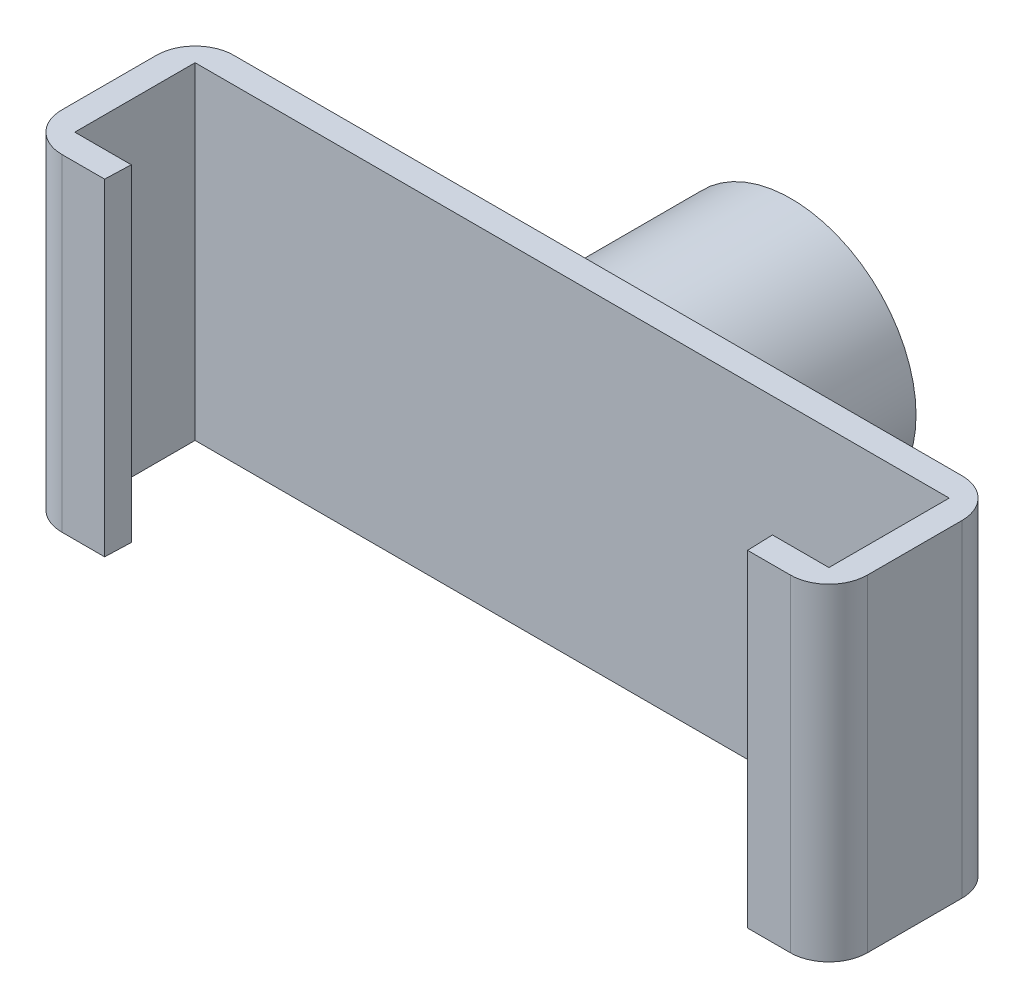
ISO-10303-21;
HEADER;
FILE_DESCRIPTION(('STEP AP214'),'2;1');
FILE_NAME('part.step','',(''),(''),'','','');
FILE_SCHEMA(('AUTOMOTIVE_DESIGN { 1 0 10303 214 1 1 1 1 }'));
ENDSEC;
DATA;
#1=APPLICATION_CONTEXT('core data for automotive mechanical design processes');
#2=APPLICATION_PROTOCOL_DEFINITION('international standard','automotive_design',2000,#1);
#3=PRODUCT_CONTEXT('',#1,'mechanical');
#4=PRODUCT('Part','Part','',(#3));
#5=PRODUCT_RELATED_PRODUCT_CATEGORY('part','',(#4));
#6=PRODUCT_DEFINITION_FORMATION('','',#4);
#7=PRODUCT_DEFINITION_CONTEXT('part definition',#1,'design');
#8=PRODUCT_DEFINITION('design','',#6,#7);
#9=PRODUCT_DEFINITION_SHAPE('','',#8);
#10=(LENGTH_UNIT() NAMED_UNIT(*) SI_UNIT(.MILLI.,.METRE.));
#11=(NAMED_UNIT(*) PLANE_ANGLE_UNIT() SI_UNIT($,.RADIAN.));
#12=(NAMED_UNIT(*) SI_UNIT($,.STERADIAN.) SOLID_ANGLE_UNIT());
#13=UNCERTAINTY_MEASURE_WITH_UNIT(LENGTH_MEASURE(1.E-05),#10,'distance_accuracy_value','');
#14=(GEOMETRIC_REPRESENTATION_CONTEXT(3) GLOBAL_UNCERTAINTY_ASSIGNED_CONTEXT((#13)) GLOBAL_UNIT_ASSIGNED_CONTEXT((#10,
#11,#12)) REPRESENTATION_CONTEXT('',''));
#15=CARTESIAN_POINT('',(0.,0.,0.));
#16=DIRECTION('',(0.,0.,1.));
#17=DIRECTION('',(1.,0.,0.));
#18=AXIS2_PLACEMENT_3D('',#15,#16,#17);
#19=CARTESIAN_POINT('',(-31.275,12.7,-2.));
#20=DIRECTION('',(0.,0.,1.));
#21=DIRECTION('',(1.,0.,0.));
#22=AXIS2_PLACEMENT_3D('',#19,#20,#21);
#23=PLANE('',#22);
#24=CARTESIAN_POINT('',(0.,0.,-2.));
#25=DIRECTION('',(0.,0.,1.));
#26=DIRECTION('',(1.,0.,0.));
#27=AXIS2_PLACEMENT_3D('',#24,#25,#26);
#28=CIRCLE('',#27,11.7);
#29=CARTESIAN_POINT('',(11.7,0.,-2.));
#30=VERTEX_POINT('',#29);
#31=EDGE_CURVE('E11',#30,#30,#28,.T.);
#32=ORIENTED_EDGE('',*,*,#31,.T.);
#33=EDGE_LOOP('',(#32));
#34=FACE_BOUND('',#33,.T.);
#35=DIRECTION('',(-1.,0.,0.));
#36=VECTOR('',#35,1.);
#37=CARTESIAN_POINT('',(-31.275,12.7,-2.));
#38=LINE('',#37,#36);
#39=CARTESIAN_POINT('',(28.275,12.7,-2.));
#40=VERTEX_POINT('',#39);
#41=CARTESIAN_POINT('',(-28.275,12.7,-2.));
#42=VERTEX_POINT('',#41);
#43=EDGE_CURVE('E353',#40,#42,#38,.T.);
#44=ORIENTED_EDGE('',*,*,#43,.F.);
#45=DIRECTION('',(0.,-1.,0.));
#46=VECTOR('',#45,1.);
#47=CARTESIAN_POINT('',(28.275,12.7,-2.));
#48=LINE('',#47,#46);
#49=CARTESIAN_POINT('',(28.275,-12.7,-2.));
#50=VERTEX_POINT('',#49);
#51=EDGE_CURVE('E177',#40,#50,#48,.T.);
#52=ORIENTED_EDGE('',*,*,#51,.T.);
#53=DIRECTION('',(-1.,0.,0.));
#54=VECTOR('',#53,1.);
#55=CARTESIAN_POINT('',(-31.275,-12.7,-2.));
#56=LINE('',#55,#54);
#57=CARTESIAN_POINT('',(-28.275,-12.7,-2.));
#58=VERTEX_POINT('',#57);
#59=EDGE_CURVE('E305',#50,#58,#56,.T.);
#60=ORIENTED_EDGE('',*,*,#59,.T.);
#61=DIRECTION('',(0.,-1.,0.));
#62=VECTOR('',#61,1.);
#63=CARTESIAN_POINT('',(-28.275,12.7,-2.));
#64=LINE('',#63,#62);
#65=EDGE_CURVE('E175',#58,#42,#64,.F.);
#66=ORIENTED_EDGE('',*,*,#65,.T.);
#67=EDGE_LOOP('',(#44,#52,#60,#66));
#68=FACE_BOUND('',#67,.T.);
#69=ADVANCED_FACE('F34',(#34,#68),#23,.F.);
#70=CARTESIAN_POINT('',(-29.275,12.7,9.34));
#71=DIRECTION('',(0.,0.,1.));
#72=DIRECTION('',(1.,0.,0.));
#73=AXIS2_PLACEMENT_3D('',#70,#71,#72);
#74=PLANE('',#73);
#75=DIRECTION('',(-1.,0.,0.));
#76=VECTOR('',#75,1.);
#77=CARTESIAN_POINT('',(-29.275,-12.7,9.34));
#78=LINE('',#77,#76);
#79=CARTESIAN_POINT('',(-24.89,-12.7,9.34));
#80=VERTEX_POINT('',#79);
#81=CARTESIAN_POINT('',(-29.275,-12.7,9.34));
#82=VERTEX_POINT('',#81);
#83=EDGE_CURVE('E174',#80,#82,#78,.T.);
#84=ORIENTED_EDGE('',*,*,#83,.T.);
#85=DIRECTION('',(0.,-1.,0.));
#86=VECTOR('',#85,1.);
#87=CARTESIAN_POINT('',(-29.275,12.7,9.34));
#88=LINE('',#87,#86);
#89=CARTESIAN_POINT('',(-29.275,12.7,9.34));
#90=VERTEX_POINT('',#89);
#91=EDGE_CURVE('E154',#90,#82,#88,.T.);
#92=ORIENTED_EDGE('',*,*,#91,.F.);
#93=DIRECTION('',(-1.,0.,0.));
#94=VECTOR('',#93,1.);
#95=CARTESIAN_POINT('',(-29.275,12.7,9.34));
#96=LINE('',#95,#94);
#97=CARTESIAN_POINT('',(-24.89,12.7,9.34));
#98=VERTEX_POINT('',#97);
#99=EDGE_CURVE('E160',#98,#90,#96,.T.);
#100=ORIENTED_EDGE('',*,*,#99,.F.);
#101=DIRECTION('',(0.,-1.,0.));
#102=VECTOR('',#101,1.);
#103=CARTESIAN_POINT('',(-24.89,12.7,9.34));
#104=LINE('',#103,#102);
#105=EDGE_CURVE('E309',#98,#80,#104,.T.);
#106=ORIENTED_EDGE('',*,*,#105,.T.);
#107=EDGE_LOOP('',(#84,#92,#100,#106));
#108=FACE_BOUND('',#107,.T.);
#109=ADVANCED_FACE('F172',(#108),#74,.F.);
#110=CARTESIAN_POINT('',(-29.275,12.7,9.34));
#111=DIRECTION('',(-1.,0.,0.));
#112=DIRECTION('',(0.,0.,1.));
#113=AXIS2_PLACEMENT_3D('',#110,#111,#112);
#114=PLANE('',#113);
#115=DIRECTION('',(0.,0.,-1.));
#116=VECTOR('',#115,1.);
#117=CARTESIAN_POINT('',(-29.275,-12.7,9.34));
#118=LINE('',#117,#116);
#119=CARTESIAN_POINT('',(-29.275,-12.7,0.));
#120=VERTEX_POINT('',#119);
#121=EDGE_CURVE('E335',#82,#120,#118,.T.);
#122=ORIENTED_EDGE('',*,*,#121,.T.);
#123=DIRECTION('',(0.,-1.,0.));
#124=VECTOR('',#123,1.);
#125=CARTESIAN_POINT('',(-29.275,12.7,0.));
#126=LINE('',#125,#124);
#127=CARTESIAN_POINT('',(-29.275,12.7,0.));
#128=VERTEX_POINT('',#127);
#129=EDGE_CURVE('E157',#128,#120,#126,.T.);
#130=ORIENTED_EDGE('',*,*,#129,.F.);
#131=DIRECTION('',(0.,0.,-1.));
#132=VECTOR('',#131,1.);
#133=CARTESIAN_POINT('',(-29.275,12.7,9.34));
#134=LINE('',#133,#132);
#135=EDGE_CURVE('E149',#90,#128,#134,.T.);
#136=ORIENTED_EDGE('',*,*,#135,.F.);
#137=ORIENTED_EDGE('',*,*,#91,.T.);
#138=EDGE_LOOP('',(#122,#130,#136,#137));
#139=FACE_BOUND('',#138,.T.);
#140=ADVANCED_FACE('F152',(#139),#114,.F.);
#141=CARTESIAN_POINT('',(29.275,12.7,0.));
#142=DIRECTION('',(0.,0.,-1.));
#143=DIRECTION('',(-1.,0.,0.));
#144=AXIS2_PLACEMENT_3D('',#141,#142,#143);
#145=PLANE('',#144);
#146=DIRECTION('',(1.,0.,0.));
#147=VECTOR('',#146,1.);
#148=CARTESIAN_POINT('',(29.275,-12.7,0.));
#149=LINE('',#148,#147);
#150=CARTESIAN_POINT('',(29.275,-12.7,0.));
#151=VERTEX_POINT('',#150);
#152=EDGE_CURVE('E329',#120,#151,#149,.T.);
#153=ORIENTED_EDGE('',*,*,#152,.T.);
#154=DIRECTION('',(0.,-1.,0.));
#155=VECTOR('',#154,1.);
#156=CARTESIAN_POINT('',(29.275,12.7,0.));
#157=LINE('',#156,#155);
#158=CARTESIAN_POINT('',(29.275,12.7,0.));
#159=VERTEX_POINT('',#158);
#160=EDGE_CURVE('E179',#159,#151,#157,.T.);
#161=ORIENTED_EDGE('',*,*,#160,.F.);
#162=DIRECTION('',(1.,0.,0.));
#163=VECTOR('',#162,1.);
#164=CARTESIAN_POINT('',(-20.505,12.7,0.));
#165=LINE('',#164,#163);
#166=EDGE_CURVE('E159',#128,#159,#165,.T.);
#167=ORIENTED_EDGE('',*,*,#166,.F.);
#168=ORIENTED_EDGE('',*,*,#129,.T.);
#169=EDGE_LOOP('',(#153,#161,#167,#168));
#170=FACE_BOUND('',#169,.T.);
#171=ADVANCED_FACE('F264',(#170),#145,.F.);
#172=CARTESIAN_POINT('',(29.275,12.7,0.));
#173=DIRECTION('',(1.,0.,0.));
#174=DIRECTION('',(0.,0.,-1.));
#175=AXIS2_PLACEMENT_3D('',#172,#173,#174);
#176=PLANE('',#175);
#177=DIRECTION('',(0.,0.,1.));
#178=VECTOR('',#177,1.);
#179=CARTESIAN_POINT('',(29.275,-12.7,0.));
#180=LINE('',#179,#178);
#181=CARTESIAN_POINT('',(29.275,-12.7,9.34));
#182=VERTEX_POINT('',#181);
#183=EDGE_CURVE('E326',#151,#182,#180,.T.);
#184=ORIENTED_EDGE('',*,*,#183,.T.);
#185=DIRECTION('',(0.,-1.,0.));
#186=VECTOR('',#185,1.);
#187=CARTESIAN_POINT('',(29.275,12.7,9.34));
#188=LINE('',#187,#186);
#189=CARTESIAN_POINT('',(29.275,12.7,9.34));
#190=VERTEX_POINT('',#189);
#191=EDGE_CURVE('E319',#190,#182,#188,.T.);
#192=ORIENTED_EDGE('',*,*,#191,.F.);
#193=DIRECTION('',(0.,0.,1.));
#194=VECTOR('',#193,1.);
#195=CARTESIAN_POINT('',(29.275,12.7,0.));
#196=LINE('',#195,#194);
#197=EDGE_CURVE('E327',#159,#190,#196,.T.);
#198=ORIENTED_EDGE('',*,*,#197,.F.);
#199=ORIENTED_EDGE('',*,*,#160,.T.);
#200=EDGE_LOOP('',(#184,#192,#198,#199));
#201=FACE_BOUND('',#200,.T.);
#202=ADVANCED_FACE('F260',(#201),#176,.F.);
#203=CARTESIAN_POINT('',(24.89,12.7,9.34));
#204=DIRECTION('',(0.,0.,1.));
#205=DIRECTION('',(1.,0.,0.));
#206=AXIS2_PLACEMENT_3D('',#203,#204,#205);
#207=PLANE('',#206);
#208=DIRECTION('',(-1.,0.,0.));
#209=VECTOR('',#208,1.);
#210=CARTESIAN_POINT('',(24.89,-12.7,9.34));
#211=LINE('',#210,#209);
#212=CARTESIAN_POINT('',(24.89,-12.7,9.34));
#213=VERTEX_POINT('',#212);
#214=EDGE_CURVE('E331',#182,#213,#211,.T.);
#215=ORIENTED_EDGE('',*,*,#214,.T.);
#216=DIRECTION('',(0.,-1.,0.));
#217=VECTOR('',#216,1.);
#218=CARTESIAN_POINT('',(24.89,12.7,9.34));
#219=LINE('',#218,#217);
#220=CARTESIAN_POINT('',(24.89,12.7,9.34));
#221=VERTEX_POINT('',#220);
#222=EDGE_CURVE('E316',#221,#213,#219,.T.);
#223=ORIENTED_EDGE('',*,*,#222,.F.);
#224=DIRECTION('',(-1.,0.,0.));
#225=VECTOR('',#224,1.);
#226=CARTESIAN_POINT('',(24.89,12.7,9.34));
#227=LINE('',#226,#225);
#228=EDGE_CURVE('E362',#190,#221,#227,.T.);
#229=ORIENTED_EDGE('',*,*,#228,.F.);
#230=ORIENTED_EDGE('',*,*,#191,.T.);
#231=EDGE_LOOP('',(#215,#223,#229,#230));
#232=FACE_BOUND('',#231,.T.);
#233=ADVANCED_FACE('F256',(#232),#207,.F.);
#234=CARTESIAN_POINT('',(24.96,12.7,11.34));
#235=DIRECTION('',(0.999388062160532,0.,-0.0349785821756086));
#236=DIRECTION('',(-0.0349785821756086,0.,-0.999388062160533));
#237=AXIS2_PLACEMENT_3D('',#234,#235,#236);
#238=PLANE('',#237);
#239=DIRECTION('',(0.0349785821756086,0.,0.999388062160533));
#240=VECTOR('',#239,1.);
#241=CARTESIAN_POINT('',(24.96,-12.7,11.34));
#242=LINE('',#241,#240);
#243=CARTESIAN_POINT('',(24.96,-12.7,11.34));
#244=VERTEX_POINT('',#243);
#245=EDGE_CURVE('E333',#213,#244,#242,.T.);
#246=ORIENTED_EDGE('',*,*,#245,.T.);
#247=DIRECTION('',(0.,-1.,0.));
#248=VECTOR('',#247,1.);
#249=CARTESIAN_POINT('',(24.96,12.7,11.34));
#250=LINE('',#249,#248);
#251=CARTESIAN_POINT('',(24.96,12.7,11.34));
#252=VERTEX_POINT('',#251);
#253=EDGE_CURVE('E313',#252,#244,#250,.T.);
#254=ORIENTED_EDGE('',*,*,#253,.F.);
#255=DIRECTION('',(0.0349785821756086,0.,0.999388062160533));
#256=VECTOR('',#255,1.);
#257=CARTESIAN_POINT('',(24.96,12.7,11.34));
#258=LINE('',#257,#256);
#259=EDGE_CURVE('E366',#221,#252,#258,.T.);
#260=ORIENTED_EDGE('',*,*,#259,.F.);
#261=ORIENTED_EDGE('',*,*,#222,.T.);
#262=EDGE_LOOP('',(#246,#254,#260,#261));
#263=FACE_BOUND('',#262,.T.);
#264=ADVANCED_FACE('F252',(#263),#238,.F.);
#265=CARTESIAN_POINT('',(31.275,12.7,11.34));
#266=DIRECTION('',(0.,0.,-1.));
#267=DIRECTION('',(-1.,0.,0.));
#268=AXIS2_PLACEMENT_3D('',#265,#266,#267);
#269=PLANE('',#268);
#270=DIRECTION('',(1.,0.,0.));
#271=VECTOR('',#270,1.);
#272=CARTESIAN_POINT('',(31.275,-12.7,11.34));
#273=LINE('',#272,#271);
#274=CARTESIAN_POINT('',(28.275,-12.7,11.34));
#275=VERTEX_POINT('',#274);
#276=EDGE_CURVE('E340',#244,#275,#273,.T.);
#277=ORIENTED_EDGE('',*,*,#276,.T.);
#278=DIRECTION('',(0.,-1.,0.));
#279=VECTOR('',#278,1.);
#280=CARTESIAN_POINT('',(28.275,12.7,11.34));
#281=LINE('',#280,#279);
#282=CARTESIAN_POINT('',(28.275,12.7,11.34));
#283=VERTEX_POINT('',#282);
#284=EDGE_CURVE('E205',#275,#283,#281,.F.);
#285=ORIENTED_EDGE('',*,*,#284,.T.);
#286=DIRECTION('',(1.,0.,0.));
#287=VECTOR('',#286,1.);
#288=CARTESIAN_POINT('',(31.275,12.7,11.34));
#289=LINE('',#288,#287);
#290=EDGE_CURVE('E368',#252,#283,#289,.T.);
#291=ORIENTED_EDGE('',*,*,#290,.F.);
#292=ORIENTED_EDGE('',*,*,#253,.T.);
#293=EDGE_LOOP('',(#277,#285,#291,#292));
#294=FACE_BOUND('',#293,.T.);
#295=ADVANCED_FACE('F248',(#294),#269,.F.);
#296=CARTESIAN_POINT('',(31.275,12.7,-2.));
#297=DIRECTION('',(-1.,0.,0.));
#298=DIRECTION('',(0.,0.,1.));
#299=AXIS2_PLACEMENT_3D('',#296,#297,#298);
#300=PLANE('',#299);
#301=DIRECTION('',(0.,0.,-1.));
#302=VECTOR('',#301,1.);
#303=CARTESIAN_POINT('',(31.275,-12.7,-2.));
#304=LINE('',#303,#302);
#305=CARTESIAN_POINT('',(31.275,-12.7,8.34));
#306=VERTEX_POINT('',#305);
#307=CARTESIAN_POINT('',(31.275,-12.7,1.));
#308=VERTEX_POINT('',#307);
#309=EDGE_CURVE('E343',#306,#308,#304,.T.);
#310=ORIENTED_EDGE('',*,*,#309,.T.);
#311=DIRECTION('',(0.,-1.,0.));
#312=VECTOR('',#311,1.);
#313=CARTESIAN_POINT('',(31.275,12.7,1.));
#314=LINE('',#313,#312);
#315=CARTESIAN_POINT('',(31.275,12.7,1.));
#316=VERTEX_POINT('',#315);
#317=EDGE_CURVE('E196',#308,#316,#314,.F.);
#318=ORIENTED_EDGE('',*,*,#317,.T.);
#319=DIRECTION('',(0.,0.,-1.));
#320=VECTOR('',#319,1.);
#321=CARTESIAN_POINT('',(31.275,12.7,-2.));
#322=LINE('',#321,#320);
#323=CARTESIAN_POINT('',(31.275,12.7,8.34));
#324=VERTEX_POINT('',#323);
#325=EDGE_CURVE('E356',#324,#316,#322,.T.);
#326=ORIENTED_EDGE('',*,*,#325,.F.);
#327=DIRECTION('',(0.,-1.,0.));
#328=VECTOR('',#327,1.);
#329=CARTESIAN_POINT('',(31.275,12.7,8.34));
#330=LINE('',#329,#328);
#331=EDGE_CURVE('E193',#324,#306,#330,.T.);
#332=ORIENTED_EDGE('',*,*,#331,.T.);
#333=EDGE_LOOP('',(#310,#318,#326,#332));
#334=FACE_BOUND('',#333,.T.);
#335=ADVANCED_FACE('F245',(#334),#300,.F.);
#336=CARTESIAN_POINT('',(-31.275,12.7,11.34));
#337=DIRECTION('',(1.,0.,0.));
#338=DIRECTION('',(0.,0.,-1.));
#339=AXIS2_PLACEMENT_3D('',#336,#337,#338);
#340=PLANE('',#339);
#341=DIRECTION('',(0.,0.,1.));
#342=VECTOR('',#341,1.);
#343=CARTESIAN_POINT('',(-31.275,12.7,11.34));
#344=LINE('',#343,#342);
#345=CARTESIAN_POINT('',(-31.275,12.7,1.));
#346=VERTEX_POINT('',#345);
#347=CARTESIAN_POINT('',(-31.275,12.7,8.34));
#348=VERTEX_POINT('',#347);
#349=EDGE_CURVE('E352',#346,#348,#344,.T.);
#350=ORIENTED_EDGE('',*,*,#349,.F.);
#351=DIRECTION('',(0.,-1.,0.));
#352=VECTOR('',#351,1.);
#353=CARTESIAN_POINT('',(-31.275,12.7,1.));
#354=LINE('',#353,#352);
#355=CARTESIAN_POINT('',(-31.275,-12.7,1.));
#356=VERTEX_POINT('',#355);
#357=EDGE_CURVE('E208',#346,#356,#354,.T.);
#358=ORIENTED_EDGE('',*,*,#357,.T.);
#359=DIRECTION('',(0.,0.,1.));
#360=VECTOR('',#359,1.);
#361=CARTESIAN_POINT('',(-31.275,-12.7,11.34));
#362=LINE('',#361,#360);
#363=CARTESIAN_POINT('',(-31.275,-12.7,8.34));
#364=VERTEX_POINT('',#363);
#365=EDGE_CURVE('E302',#356,#364,#362,.T.);
#366=ORIENTED_EDGE('',*,*,#365,.T.);
#367=DIRECTION('',(0.,-1.,0.));
#368=VECTOR('',#367,1.);
#369=CARTESIAN_POINT('',(-31.275,12.7,8.34));
#370=LINE('',#369,#368);
#371=EDGE_CURVE('E57',#364,#348,#370,.F.);
#372=ORIENTED_EDGE('',*,*,#371,.T.);
#373=EDGE_LOOP('',(#350,#358,#366,#372));
#374=FACE_BOUND('',#373,.T.);
#375=ADVANCED_FACE('F243',(#374),#340,.F.);
#376=CARTESIAN_POINT('',(-24.96,12.7,11.34));
#377=DIRECTION('',(0.,0.,-1.));
#378=DIRECTION('',(-1.,0.,0.));
#379=AXIS2_PLACEMENT_3D('',#376,#377,#378);
#380=PLANE('',#379);
#381=DIRECTION('',(1.,0.,0.));
#382=VECTOR('',#381,1.);
#383=CARTESIAN_POINT('',(-24.96,12.7,11.34));
#384=LINE('',#383,#382);
#385=CARTESIAN_POINT('',(-28.275,12.7,11.34));
#386=VERTEX_POINT('',#385);
#387=CARTESIAN_POINT('',(-24.96,12.7,11.34));
#388=VERTEX_POINT('',#387);
#389=EDGE_CURVE('E297',#386,#388,#384,.T.);
#390=ORIENTED_EDGE('',*,*,#389,.F.);
#391=DIRECTION('',(0.,-1.,0.));
#392=VECTOR('',#391,1.);
#393=CARTESIAN_POINT('',(-28.275,12.7,11.34));
#394=LINE('',#393,#392);
#395=CARTESIAN_POINT('',(-28.275,-12.7,11.34));
#396=VERTEX_POINT('',#395);
#397=EDGE_CURVE('E211',#386,#396,#394,.T.);
#398=ORIENTED_EDGE('',*,*,#397,.T.);
#399=DIRECTION('',(1.,0.,0.));
#400=VECTOR('',#399,1.);
#401=CARTESIAN_POINT('',(-24.96,-12.7,11.34));
#402=LINE('',#401,#400);
#403=CARTESIAN_POINT('',(-24.96,-12.7,11.34));
#404=VERTEX_POINT('',#403);
#405=EDGE_CURVE('E295',#396,#404,#402,.T.);
#406=ORIENTED_EDGE('',*,*,#405,.T.);
#407=DIRECTION('',(0.,-1.,0.));
#408=VECTOR('',#407,1.);
#409=CARTESIAN_POINT('',(-24.96,12.7,11.34));
#410=LINE('',#409,#408);
#411=EDGE_CURVE('E311',#388,#404,#410,.T.);
#412=ORIENTED_EDGE('',*,*,#411,.F.);
#413=EDGE_LOOP('',(#390,#398,#406,#412));
#414=FACE_BOUND('',#413,.T.);
#415=ADVANCED_FACE('F293',(#414),#380,.F.);
#416=CARTESIAN_POINT('',(-24.89,12.7,9.34));
#417=DIRECTION('',(-0.999388062160532,0.,-0.0349785821756171));
#418=DIRECTION('',(-0.0349785821756171,0.,0.999388062160532));
#419=AXIS2_PLACEMENT_3D('',#416,#417,#418);
#420=PLANE('',#419);
#421=DIRECTION('',(0.0349785821756171,0.,-0.999388062160532));
#422=VECTOR('',#421,1.);
#423=CARTESIAN_POINT('',(-24.89,-12.7,9.34));
#424=LINE('',#423,#422);
#425=EDGE_CURVE('E170',#404,#80,#424,.T.);
#426=ORIENTED_EDGE('',*,*,#425,.T.);
#427=ORIENTED_EDGE('',*,*,#105,.F.);
#428=DIRECTION('',(0.0349785821756171,0.,-0.999388062160532));
#429=VECTOR('',#428,1.);
#430=CARTESIAN_POINT('',(-24.89,12.7,9.34));
#431=LINE('',#430,#429);
#432=EDGE_CURVE('E166',#388,#98,#431,.T.);
#433=ORIENTED_EDGE('',*,*,#432,.F.);
#434=ORIENTED_EDGE('',*,*,#411,.T.);
#435=EDGE_LOOP('',(#426,#427,#433,#434));
#436=FACE_BOUND('',#435,.T.);
#437=ADVANCED_FACE('F396',(#436),#420,.F.);
#438=CARTESIAN_POINT('',(-31.275,12.7,9.34));
#439=DIRECTION('',(0.,1.,0.));
#440=DIRECTION('',(0.,0.,1.));
#441=AXIS2_PLACEMENT_3D('',#438,#439,#440);
#442=PLANE('',#441);
#443=ORIENTED_EDGE('',*,*,#325,.T.);
#444=CARTESIAN_POINT('',(28.275,12.7,1.));
#445=DIRECTION('',(0.,1.,0.));
#446=DIRECTION('',(0.,0.,1.));
#447=AXIS2_PLACEMENT_3D('',#444,#445,#446);
#448=CIRCLE('',#447,3.);
#449=EDGE_CURVE('E203',#316,#40,#448,.T.);
#450=ORIENTED_EDGE('',*,*,#449,.T.);
#451=ORIENTED_EDGE('',*,*,#43,.T.);
#452=CARTESIAN_POINT('',(-28.275,12.7,1.));
#453=DIRECTION('',(0.,1.,0.));
#454=DIRECTION('',(0.,0.,1.));
#455=AXIS2_PLACEMENT_3D('',#452,#453,#454);
#456=CIRCLE('',#455,3.);
#457=EDGE_CURVE('E199',#42,#346,#456,.T.);
#458=ORIENTED_EDGE('',*,*,#457,.T.);
#459=ORIENTED_EDGE('',*,*,#349,.T.);
#460=CARTESIAN_POINT('',(-28.275,12.7,8.34));
#461=DIRECTION('',(0.,1.,0.));
#462=DIRECTION('',(0.,0.,1.));
#463=AXIS2_PLACEMENT_3D('',#460,#461,#462);
#464=CIRCLE('',#463,3.);
#465=EDGE_CURVE('E49',#348,#386,#464,.T.);
#466=ORIENTED_EDGE('',*,*,#465,.T.);
#467=ORIENTED_EDGE('',*,*,#389,.T.);
#468=ORIENTED_EDGE('',*,*,#432,.T.);
#469=ORIENTED_EDGE('',*,*,#99,.T.);
#470=ORIENTED_EDGE('',*,*,#135,.T.);
#471=ORIENTED_EDGE('',*,*,#166,.T.);
#472=ORIENTED_EDGE('',*,*,#197,.T.);
#473=ORIENTED_EDGE('',*,*,#228,.T.);
#474=ORIENTED_EDGE('',*,*,#259,.T.);
#475=ORIENTED_EDGE('',*,*,#290,.T.);
#476=CARTESIAN_POINT('',(28.275,12.7,8.34));
#477=DIRECTION('',(0.,1.,0.));
#478=DIRECTION('',(0.,0.,1.));
#479=AXIS2_PLACEMENT_3D('',#476,#477,#478);
#480=CIRCLE('',#479,3.);
#481=EDGE_CURVE('E201',#283,#324,#480,.T.);
#482=ORIENTED_EDGE('',*,*,#481,.T.);
#483=EDGE_LOOP('',(#443,#450,#451,#458,#459,#466,#467,#468,#469,#470,#471,#472,#473,#474,#475,#482));
#484=FACE_BOUND('',#483,.T.);
#485=ADVANCED_FACE('F164',(#484),#442,.T.);
#486=CARTESIAN_POINT('',(-31.275,-12.7,9.34));
#487=DIRECTION('',(0.,1.,0.));
#488=DIRECTION('',(0.,0.,1.));
#489=AXIS2_PLACEMENT_3D('',#486,#487,#488);
#490=PLANE('',#489);
#491=ORIENTED_EDGE('',*,*,#59,.F.);
#492=CARTESIAN_POINT('',(28.275,-12.7,1.));
#493=DIRECTION('',(0.,1.,0.));
#494=DIRECTION('',(0.,0.,1.));
#495=AXIS2_PLACEMENT_3D('',#492,#493,#494);
#496=CIRCLE('',#495,3.);
#497=EDGE_CURVE('E191',#50,#308,#496,.F.);
#498=ORIENTED_EDGE('',*,*,#497,.T.);
#499=ORIENTED_EDGE('',*,*,#309,.F.);
#500=CARTESIAN_POINT('',(28.275,-12.7,8.34));
#501=DIRECTION('',(0.,1.,0.));
#502=DIRECTION('',(0.,0.,1.));
#503=AXIS2_PLACEMENT_3D('',#500,#501,#502);
#504=CIRCLE('',#503,3.);
#505=EDGE_CURVE('E189',#306,#275,#504,.F.);
#506=ORIENTED_EDGE('',*,*,#505,.T.);
#507=ORIENTED_EDGE('',*,*,#276,.F.);
#508=ORIENTED_EDGE('',*,*,#245,.F.);
#509=ORIENTED_EDGE('',*,*,#214,.F.);
#510=ORIENTED_EDGE('',*,*,#183,.F.);
#511=ORIENTED_EDGE('',*,*,#152,.F.);
#512=ORIENTED_EDGE('',*,*,#121,.F.);
#513=ORIENTED_EDGE('',*,*,#83,.F.);
#514=ORIENTED_EDGE('',*,*,#425,.F.);
#515=ORIENTED_EDGE('',*,*,#405,.F.);
#516=CARTESIAN_POINT('',(-28.275,-12.7,8.34));
#517=DIRECTION('',(0.,1.,0.));
#518=DIRECTION('',(0.,0.,1.));
#519=AXIS2_PLACEMENT_3D('',#516,#517,#518);
#520=CIRCLE('',#519,3.);
#521=EDGE_CURVE('E185',#396,#364,#520,.F.);
#522=ORIENTED_EDGE('',*,*,#521,.T.);
#523=ORIENTED_EDGE('',*,*,#365,.F.);
#524=CARTESIAN_POINT('',(-28.275,-12.7,1.));
#525=DIRECTION('',(0.,1.,0.));
#526=DIRECTION('',(0.,0.,1.));
#527=AXIS2_PLACEMENT_3D('',#524,#525,#526);
#528=CIRCLE('',#527,3.);
#529=EDGE_CURVE('E187',#356,#58,#528,.F.);
#530=ORIENTED_EDGE('',*,*,#529,.T.);
#531=EDGE_LOOP('',(#491,#498,#499,#506,#507,#508,#509,#510,#511,#512,#513,#514,#515,#522,#523,#530));
#532=FACE_BOUND('',#531,.T.);
#533=ADVANCED_FACE('F275',(#532),#490,.F.);
#534=CARTESIAN_POINT('',(28.275,12.7,1.));
#535=DIRECTION('',(0.,-1.,0.));
#536=DIRECTION('',(0.,0.,-1.));
#537=AXIS2_PLACEMENT_3D('',#534,#535,#536);
#538=CYLINDRICAL_SURFACE('',#537,3.);
#539=ORIENTED_EDGE('',*,*,#449,.F.);
#540=ORIENTED_EDGE('',*,*,#317,.F.);
#541=ORIENTED_EDGE('',*,*,#497,.F.);
#542=ORIENTED_EDGE('',*,*,#51,.F.);
#543=EDGE_LOOP('',(#539,#540,#541,#542));
#544=FACE_BOUND('',#543,.T.);
#545=ADVANCED_FACE('F271',(#544),#538,.T.);
#546=CARTESIAN_POINT('',(28.275,12.7,8.34));
#547=DIRECTION('',(0.,-1.,0.));
#548=DIRECTION('',(0.,0.,-1.));
#549=AXIS2_PLACEMENT_3D('',#546,#547,#548);
#550=CYLINDRICAL_SURFACE('',#549,3.);
#551=ORIENTED_EDGE('',*,*,#481,.F.);
#552=ORIENTED_EDGE('',*,*,#284,.F.);
#553=ORIENTED_EDGE('',*,*,#505,.F.);
#554=ORIENTED_EDGE('',*,*,#331,.F.);
#555=EDGE_LOOP('',(#551,#552,#553,#554));
#556=FACE_BOUND('',#555,.T.);
#557=ADVANCED_FACE('F274',(#556),#550,.T.);
#558=CARTESIAN_POINT('',(-28.275,12.7,1.));
#559=DIRECTION('',(0.,-1.,0.));
#560=DIRECTION('',(0.,0.,-1.));
#561=AXIS2_PLACEMENT_3D('',#558,#559,#560);
#562=CYLINDRICAL_SURFACE('',#561,3.);
#563=ORIENTED_EDGE('',*,*,#457,.F.);
#564=ORIENTED_EDGE('',*,*,#65,.F.);
#565=ORIENTED_EDGE('',*,*,#529,.F.);
#566=ORIENTED_EDGE('',*,*,#357,.F.);
#567=EDGE_LOOP('',(#563,#564,#565,#566));
#568=FACE_BOUND('',#567,.T.);
#569=ADVANCED_FACE('F279',(#568),#562,.T.);
#570=CARTESIAN_POINT('',(-28.275,12.7,8.34));
#571=DIRECTION('',(0.,-1.,0.));
#572=DIRECTION('',(0.,0.,-1.));
#573=AXIS2_PLACEMENT_3D('',#570,#571,#572);
#574=CYLINDRICAL_SURFACE('',#573,3.);
#575=ORIENTED_EDGE('',*,*,#465,.F.);
#576=ORIENTED_EDGE('',*,*,#371,.F.);
#577=ORIENTED_EDGE('',*,*,#521,.F.);
#578=ORIENTED_EDGE('',*,*,#397,.F.);
#579=EDGE_LOOP('',(#575,#576,#577,#578));
#580=FACE_BOUND('',#579,.T.);
#581=ADVANCED_FACE('F282',(#580),#574,.T.);
#582=CARTESIAN_POINT('',(0.,0.,-17.));
#583=DIRECTION('',(0.,0.,1.));
#584=DIRECTION('',(1.,0.,0.));
#585=AXIS2_PLACEMENT_3D('',#582,#583,#584);
#586=CYLINDRICAL_SURFACE('',#585,9.7);
#587=CARTESIAN_POINT('',(0.,0.,-4.));
#588=DIRECTION('',(0.,0.,1.));
#589=DIRECTION('',(1.,0.,0.));
#590=AXIS2_PLACEMENT_3D('',#587,#588,#589);
#591=CIRCLE('',#590,9.7);
#592=CARTESIAN_POINT('',(9.7,0.,-4.));
#593=VERTEX_POINT('',#592);
#594=EDGE_CURVE('E42',#593,#593,#591,.F.);
#595=ORIENTED_EDGE('',*,*,#594,.T.);
#596=EDGE_LOOP('',(#595));
#597=FACE_BOUND('',#596,.T.);
#598=CARTESIAN_POINT('',(0.,0.,-17.));
#599=DIRECTION('',(0.,0.,-1.));
#600=DIRECTION('',(-1.,0.,0.));
#601=AXIS2_PLACEMENT_3D('',#598,#599,#600);
#602=CIRCLE('',#601,9.7);
#603=CARTESIAN_POINT('',(-9.7,0.,-17.));
#604=VERTEX_POINT('',#603);
#605=EDGE_CURVE('E216',#604,#604,#602,.T.);
#606=ORIENTED_EDGE('',*,*,#605,.F.);
#607=EDGE_LOOP('',(#606));
#608=FACE_BOUND('',#607,.T.);
#609=ADVANCED_FACE('F220',(#597,#608),#586,.T.);
#610=CARTESIAN_POINT('',(0.,0.,-17.));
#611=DIRECTION('',(0.,0.,-1.));
#612=DIRECTION('',(-1.,0.,0.));
#613=AXIS2_PLACEMENT_3D('',#610,#611,#612);
#614=PLANE('',#613);
#615=CARTESIAN_POINT('',(0.,0.,-17.));
#616=DIRECTION('',(0.,0.,-1.));
#617=DIRECTION('',(-1.,0.,0.));
#618=AXIS2_PLACEMENT_3D('',#615,#616,#617);
#619=CIRCLE('',#618,7.63478879865056);
#620=CARTESIAN_POINT('',(-7.63478879865056,0.,-17.));
#621=VERTEX_POINT('',#620);
#622=EDGE_CURVE('E214',#621,#621,#619,.T.);
#623=ORIENTED_EDGE('',*,*,#622,.F.);
#624=EDGE_LOOP('',(#623));
#625=FACE_BOUND('',#624,.T.);
#626=ORIENTED_EDGE('',*,*,#605,.T.);
#627=EDGE_LOOP('',(#626));
#628=FACE_BOUND('',#627,.T.);
#629=ADVANCED_FACE('F229',(#625,#628),#614,.T.);
#630=CARTESIAN_POINT('',(0.,0.,-16.));
#631=DIRECTION('',(0.,0.,-1.));
#632=DIRECTION('',(1.,0.,0.));
#633=AXIS2_PLACEMENT_3D('',#630,#631,#632);
#634=SPHERICAL_SURFACE('',#633,7.7);
#635=ORIENTED_EDGE('',*,*,#622,.T.);
#636=EDGE_LOOP('',(#635));
#637=FACE_BOUND('',#636,.T.);
#638=ADVANCED_FACE('F224',(#637),#634,.F.);
#639=CARTESIAN_POINT('',(0.,0.,-4.));
#640=DIRECTION('',(0.,0.,1.));
#641=DIRECTION('',(1.,0.,0.));
#642=AXIS2_PLACEMENT_3D('',#639,#640,#641);
#643=TOROIDAL_SURFACE('',#642,11.7,2.);
#644=ORIENTED_EDGE('',*,*,#31,.F.);
#645=EDGE_LOOP('',(#644));
#646=FACE_BOUND('',#645,.T.);
#647=ORIENTED_EDGE('',*,*,#594,.F.);
#648=EDGE_LOOP('',(#647));
#649=FACE_BOUND('',#648,.T.);
#650=ADVANCED_FACE('F36',(#646,#649),#643,.F.);
#651=CLOSED_SHELL('',(#69,#109,#140,#171,#202,#233,#264,#295,#335,#375,#415,#437,#485,#533,#545,
#557,#569,#581,#609,#629,#638,#650));
#652=MANIFOLD_SOLID_BREP('B2',#651);
#653=ADVANCED_BREP_SHAPE_REPRESENTATION('',(#18,#652),#14);
#654=SHAPE_DEFINITION_REPRESENTATION(#9,#653);
ENDSEC;
END-ISO-10303-21;
